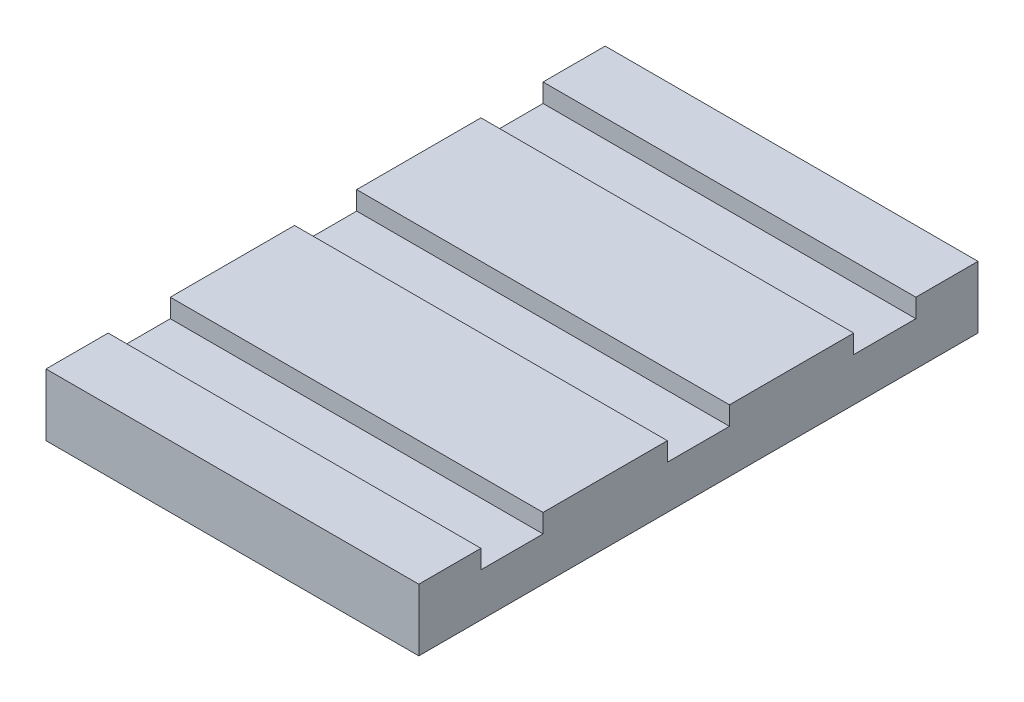
ISO-10303-21;
HEADER;
FILE_DESCRIPTION(('STEP AP214'),'2;1');
FILE_NAME('part.step','',(''),(''),'','','');
FILE_SCHEMA(('AUTOMOTIVE_DESIGN { 1 0 10303 214 1 1 1 1 }'));
ENDSEC;
DATA;
#1=APPLICATION_CONTEXT('core data for automotive mechanical design processes');
#2=APPLICATION_PROTOCOL_DEFINITION('international standard','automotive_design',2000,#1);
#3=PRODUCT_CONTEXT('',#1,'mechanical');
#4=PRODUCT('Part','Part','',(#3));
#5=PRODUCT_RELATED_PRODUCT_CATEGORY('part','',(#4));
#6=PRODUCT_DEFINITION_FORMATION('','',#4);
#7=PRODUCT_DEFINITION_CONTEXT('part definition',#1,'design');
#8=PRODUCT_DEFINITION('design','',#6,#7);
#9=PRODUCT_DEFINITION_SHAPE('','',#8);
#10=(LENGTH_UNIT() NAMED_UNIT(*) SI_UNIT(.MILLI.,.METRE.));
#11=(NAMED_UNIT(*) PLANE_ANGLE_UNIT() SI_UNIT($,.RADIAN.));
#12=(NAMED_UNIT(*) SI_UNIT($,.STERADIAN.) SOLID_ANGLE_UNIT());
#13=UNCERTAINTY_MEASURE_WITH_UNIT(LENGTH_MEASURE(1.E-05),#10,'distance_accuracy_value','');
#14=(GEOMETRIC_REPRESENTATION_CONTEXT(3) GLOBAL_UNCERTAINTY_ASSIGNED_CONTEXT((#13)) GLOBAL_UNIT_ASSIGNED_CONTEXT((#10,
#11,#12)) REPRESENTATION_CONTEXT('',''));
#15=CARTESIAN_POINT('',(0.,0.,0.));
#16=DIRECTION('',(0.,0.,1.));
#17=DIRECTION('',(1.,0.,0.));
#18=AXIS2_PLACEMENT_3D('',#15,#16,#17);
#19=CARTESIAN_POINT('',(0.,12.7,0.));
#20=DIRECTION('',(0.,1.,0.));
#21=DIRECTION('',(0.,0.,1.));
#22=AXIS2_PLACEMENT_3D('',#19,#20,#21);
#23=PLANE('',#22);
#24=DIRECTION('',(1.,0.,0.));
#25=VECTOR('',#24,1.);
#26=CARTESIAN_POINT('',(-38.1,12.7,6.35));
#27=LINE('',#26,#25);
#28=CARTESIAN_POINT('',(-38.1,12.7,6.35));
#29=VERTEX_POINT('',#28);
#30=CARTESIAN_POINT('',(38.1,12.7,6.34999999999999));
#31=VERTEX_POINT('',#30);
#32=EDGE_CURVE('E179',#29,#31,#27,.T.);
#33=ORIENTED_EDGE('',*,*,#32,.F.);
#34=DIRECTION('',(0.,0.,1.));
#35=VECTOR('',#34,1.);
#36=CARTESIAN_POINT('',(-38.1,12.7,-57.15));
#37=LINE('',#36,#35);
#38=CARTESIAN_POINT('',(-38.1,12.7,31.75));
#39=VERTEX_POINT('',#38);
#40=EDGE_CURVE('E171',#29,#39,#37,.T.);
#41=ORIENTED_EDGE('',*,*,#40,.T.);
#42=DIRECTION('',(1.,0.,0.));
#43=VECTOR('',#42,1.);
#44=CARTESIAN_POINT('',(-38.1,12.7,31.75));
#45=LINE('',#44,#43);
#46=CARTESIAN_POINT('',(38.1,12.7,31.75));
#47=VERTEX_POINT('',#46);
#48=EDGE_CURVE('E228',#39,#47,#45,.T.);
#49=ORIENTED_EDGE('',*,*,#48,.T.);
#50=DIRECTION('',(0.,0.,-1.));
#51=VECTOR('',#50,1.);
#52=CARTESIAN_POINT('',(38.1,12.7,-57.15));
#53=LINE('',#52,#51);
#54=EDGE_CURVE('E238',#47,#31,#53,.T.);
#55=ORIENTED_EDGE('',*,*,#54,.T.);
#56=EDGE_LOOP('',(#33,#41,#49,#55));
#57=FACE_BOUND('',#56,.T.);
#58=ADVANCED_FACE('F33',(#57),#23,.T.);
#59=CARTESIAN_POINT('',(38.1,12.7,-57.15));
#60=DIRECTION('',(-1.,0.,0.));
#61=DIRECTION('',(0.,0.,1.));
#62=AXIS2_PLACEMENT_3D('',#59,#60,#61);
#63=PLANE('',#62);
#64=DIRECTION('',(0.,0.,-1.));
#65=VECTOR('',#64,1.);
#66=CARTESIAN_POINT('',(38.1,8.89,6.35));
#67=LINE('',#66,#65);
#68=CARTESIAN_POINT('',(38.1,8.89,6.35));
#69=VERTEX_POINT('',#68);
#70=CARTESIAN_POINT('',(38.1,8.89,-6.35));
#71=VERTEX_POINT('',#70);
#72=EDGE_CURVE('E173',#69,#71,#67,.T.);
#73=ORIENTED_EDGE('',*,*,#72,.F.);
#74=DIRECTION('',(0.,-1.,0.));
#75=VECTOR('',#74,1.);
#76=CARTESIAN_POINT('',(38.1,12.7,6.34999999999999));
#77=LINE('',#76,#75);
#78=EDGE_CURVE('E154',#31,#69,#77,.T.);
#79=ORIENTED_EDGE('',*,*,#78,.F.);
#80=ORIENTED_EDGE('',*,*,#54,.F.);
#81=DIRECTION('',(0.,1.,0.));
#82=VECTOR('',#81,1.);
#83=CARTESIAN_POINT('',(38.1,12.7,31.75));
#84=LINE('',#83,#82);
#85=CARTESIAN_POINT('',(38.1,8.89,31.75));
#86=VERTEX_POINT('',#85);
#87=EDGE_CURVE('E213',#86,#47,#84,.T.);
#88=ORIENTED_EDGE('',*,*,#87,.F.);
#89=DIRECTION('',(0.,0.,-1.));
#90=VECTOR('',#89,1.);
#91=CARTESIAN_POINT('',(38.1,8.89,44.45));
#92=LINE('',#91,#90);
#93=CARTESIAN_POINT('',(38.1,8.89,44.45));
#94=VERTEX_POINT('',#93);
#95=EDGE_CURVE('E221',#94,#86,#92,.T.);
#96=ORIENTED_EDGE('',*,*,#95,.F.);
#97=DIRECTION('',(0.,-1.,0.));
#98=VECTOR('',#97,1.);
#99=CARTESIAN_POINT('',(38.1,12.7,44.45));
#100=LINE('',#99,#98);
#101=CARTESIAN_POINT('',(38.1,12.7,44.45));
#102=VERTEX_POINT('',#101);
#103=EDGE_CURVE('E202',#102,#94,#100,.T.);
#104=ORIENTED_EDGE('',*,*,#103,.F.);
#105=CARTESIAN_POINT('',(38.1,12.7,57.15));
#106=VERTEX_POINT('',#105);
#107=EDGE_CURVE('E234',#106,#102,#53,.T.);
#108=ORIENTED_EDGE('',*,*,#107,.F.);
#109=DIRECTION('',(0.,-1.,0.));
#110=VECTOR('',#109,1.);
#111=CARTESIAN_POINT('',(38.1,12.7,57.15));
#112=LINE('',#111,#110);
#113=CARTESIAN_POINT('',(38.1,0.,57.15));
#114=VERTEX_POINT('',#113);
#115=EDGE_CURVE('E248',#106,#114,#112,.T.);
#116=ORIENTED_EDGE('',*,*,#115,.T.);
#117=DIRECTION('',(0.,0.,-1.));
#118=VECTOR('',#117,1.);
#119=CARTESIAN_POINT('',(38.1,0.,-57.15));
#120=LINE('',#119,#118);
#121=CARTESIAN_POINT('',(38.1,0.,-57.15));
#122=VERTEX_POINT('',#121);
#123=EDGE_CURVE('E227',#114,#122,#120,.T.);
#124=ORIENTED_EDGE('',*,*,#123,.T.);
#125=DIRECTION('',(0.,-1.,0.));
#126=VECTOR('',#125,1.);
#127=CARTESIAN_POINT('',(38.1,12.7,-57.15));
#128=LINE('',#127,#126);
#129=CARTESIAN_POINT('',(38.1,12.7,-57.15));
#130=VERTEX_POINT('',#129);
#131=EDGE_CURVE('E11',#130,#122,#128,.T.);
#132=ORIENTED_EDGE('',*,*,#131,.F.);
#133=CARTESIAN_POINT('',(38.1,12.7,-44.45));
#134=VERTEX_POINT('',#133);
#135=EDGE_CURVE('E257',#134,#130,#53,.T.);
#136=ORIENTED_EDGE('',*,*,#135,.F.);
#137=DIRECTION('',(0.,-1.,0.));
#138=VECTOR('',#137,1.);
#139=CARTESIAN_POINT('',(38.1,12.7,-44.45));
#140=LINE('',#139,#138);
#141=CARTESIAN_POINT('',(38.1,8.89,-44.45));
#142=VERTEX_POINT('',#141);
#143=EDGE_CURVE('E181',#134,#142,#140,.T.);
#144=ORIENTED_EDGE('',*,*,#143,.T.);
#145=DIRECTION('',(0.,0.,1.));
#146=VECTOR('',#145,1.);
#147=CARTESIAN_POINT('',(38.1,8.89,-44.45));
#148=LINE('',#147,#146);
#149=CARTESIAN_POINT('',(38.1,8.89,-31.75));
#150=VERTEX_POINT('',#149);
#151=EDGE_CURVE('E187',#142,#150,#148,.T.);
#152=ORIENTED_EDGE('',*,*,#151,.T.);
#153=DIRECTION('',(0.,1.,0.));
#154=VECTOR('',#153,1.);
#155=CARTESIAN_POINT('',(38.1,12.7,-31.75));
#156=LINE('',#155,#154);
#157=CARTESIAN_POINT('',(38.1,12.7,-31.75));
#158=VERTEX_POINT('',#157);
#159=EDGE_CURVE('E194',#150,#158,#156,.T.);
#160=ORIENTED_EDGE('',*,*,#159,.T.);
#161=CARTESIAN_POINT('',(38.1,12.7,-6.35));
#162=VERTEX_POINT('',#161);
#163=EDGE_CURVE('E239',#162,#158,#53,.T.);
#164=ORIENTED_EDGE('',*,*,#163,.F.);
#165=DIRECTION('',(0.,1.,0.));
#166=VECTOR('',#165,1.);
#167=CARTESIAN_POINT('',(38.1,12.7,-6.35));
#168=LINE('',#167,#166);
#169=EDGE_CURVE('E48',#71,#162,#168,.T.);
#170=ORIENTED_EDGE('',*,*,#169,.F.);
#171=EDGE_LOOP('',(#73,#79,#80,#88,#96,#104,#108,#116,#124,#132,#136,#144,#152,#160,#164,#170));
#172=FACE_BOUND('',#171,.T.);
#173=ADVANCED_FACE('F35',(#172),#63,.F.);
#174=CARTESIAN_POINT('',(-38.1,12.7,-57.15));
#175=DIRECTION('',(1.,0.,0.));
#176=DIRECTION('',(0.,0.,-1.));
#177=AXIS2_PLACEMENT_3D('',#174,#175,#176);
#178=PLANE('',#177);
#179=ORIENTED_EDGE('',*,*,#40,.F.);
#180=DIRECTION('',(0.,-1.,0.));
#181=VECTOR('',#180,1.);
#182=CARTESIAN_POINT('',(-38.1,12.7,6.35));
#183=LINE('',#182,#181);
#184=CARTESIAN_POINT('',(-38.1,8.89,6.35000000000001));
#185=VERTEX_POINT('',#184);
#186=EDGE_CURVE('E151',#29,#185,#183,.T.);
#187=ORIENTED_EDGE('',*,*,#186,.T.);
#188=DIRECTION('',(0.,0.,-1.));
#189=VECTOR('',#188,1.);
#190=CARTESIAN_POINT('',(-38.1,8.89,6.35000000000001));
#191=LINE('',#190,#189);
#192=CARTESIAN_POINT('',(-38.1,8.89,-6.34999999999999));
#193=VERTEX_POINT('',#192);
#194=EDGE_CURVE('E162',#185,#193,#191,.T.);
#195=ORIENTED_EDGE('',*,*,#194,.T.);
#196=DIRECTION('',(0.,1.,0.));
#197=VECTOR('',#196,1.);
#198=CARTESIAN_POINT('',(-38.1,12.7,-6.34999999999999));
#199=LINE('',#198,#197);
#200=CARTESIAN_POINT('',(-38.1,12.7,-6.34999999999999));
#201=VERTEX_POINT('',#200);
#202=EDGE_CURVE('E159',#193,#201,#199,.T.);
#203=ORIENTED_EDGE('',*,*,#202,.T.);
#204=CARTESIAN_POINT('',(-38.1,12.7,-31.75));
#205=VERTEX_POINT('',#204);
#206=EDGE_CURVE('E246',#205,#201,#37,.T.);
#207=ORIENTED_EDGE('',*,*,#206,.F.);
#208=DIRECTION('',(0.,1.,0.));
#209=VECTOR('',#208,1.);
#210=CARTESIAN_POINT('',(-38.1,12.7,-31.75));
#211=LINE('',#210,#209);
#212=CARTESIAN_POINT('',(-38.1,8.89,-31.75));
#213=VERTEX_POINT('',#212);
#214=EDGE_CURVE('E56',#213,#205,#211,.T.);
#215=ORIENTED_EDGE('',*,*,#214,.F.);
#216=DIRECTION('',(0.,0.,1.));
#217=VECTOR('',#216,1.);
#218=CARTESIAN_POINT('',(-38.1,8.89,-44.45));
#219=LINE('',#218,#217);
#220=CARTESIAN_POINT('',(-38.1,8.89,-44.45));
#221=VERTEX_POINT('',#220);
#222=EDGE_CURVE('E189',#221,#213,#219,.T.);
#223=ORIENTED_EDGE('',*,*,#222,.F.);
#224=DIRECTION('',(0.,-1.,0.));
#225=VECTOR('',#224,1.);
#226=CARTESIAN_POINT('',(-38.1,12.7,-44.45));
#227=LINE('',#226,#225);
#228=CARTESIAN_POINT('',(-38.1,12.7,-44.45));
#229=VERTEX_POINT('',#228);
#230=EDGE_CURVE('E185',#229,#221,#227,.T.);
#231=ORIENTED_EDGE('',*,*,#230,.F.);
#232=CARTESIAN_POINT('',(-38.1,12.7,-57.15));
#233=VERTEX_POINT('',#232);
#234=EDGE_CURVE('E242',#233,#229,#37,.T.);
#235=ORIENTED_EDGE('',*,*,#234,.F.);
#236=DIRECTION('',(0.,-1.,0.));
#237=VECTOR('',#236,1.);
#238=CARTESIAN_POINT('',(-38.1,12.7,-57.15));
#239=LINE('',#238,#237);
#240=CARTESIAN_POINT('',(-38.1,0.,-57.15));
#241=VERTEX_POINT('',#240);
#242=EDGE_CURVE('E41',#233,#241,#239,.T.);
#243=ORIENTED_EDGE('',*,*,#242,.T.);
#244=DIRECTION('',(0.,0.,1.));
#245=VECTOR('',#244,1.);
#246=CARTESIAN_POINT('',(-38.1,0.,-57.15));
#247=LINE('',#246,#245);
#248=CARTESIAN_POINT('',(-38.1,0.,57.15));
#249=VERTEX_POINT('',#248);
#250=EDGE_CURVE('E253',#241,#249,#247,.T.);
#251=ORIENTED_EDGE('',*,*,#250,.T.);
#252=DIRECTION('',(0.,-1.,0.));
#253=VECTOR('',#252,1.);
#254=CARTESIAN_POINT('',(-38.1,12.7,57.15));
#255=LINE('',#254,#253);
#256=CARTESIAN_POINT('',(-38.1,12.7,57.15));
#257=VERTEX_POINT('',#256);
#258=EDGE_CURVE('E260',#257,#249,#255,.T.);
#259=ORIENTED_EDGE('',*,*,#258,.F.);
#260=CARTESIAN_POINT('',(-38.1,12.7,44.45));
#261=VERTEX_POINT('',#260);
#262=EDGE_CURVE('E241',#261,#257,#37,.T.);
#263=ORIENTED_EDGE('',*,*,#262,.F.);
#264=DIRECTION('',(0.,-1.,0.));
#265=VECTOR('',#264,1.);
#266=CARTESIAN_POINT('',(-38.1,12.7,44.45));
#267=LINE('',#266,#265);
#268=CARTESIAN_POINT('',(-38.1,8.89,44.45));
#269=VERTEX_POINT('',#268);
#270=EDGE_CURVE('E209',#261,#269,#267,.T.);
#271=ORIENTED_EDGE('',*,*,#270,.T.);
#272=DIRECTION('',(0.,0.,-1.));
#273=VECTOR('',#272,1.);
#274=CARTESIAN_POINT('',(-38.1,8.89,44.45));
#275=LINE('',#274,#273);
#276=CARTESIAN_POINT('',(-38.1,8.89,31.75));
#277=VERTEX_POINT('',#276);
#278=EDGE_CURVE('E212',#269,#277,#275,.T.);
#279=ORIENTED_EDGE('',*,*,#278,.T.);
#280=DIRECTION('',(0.,1.,0.));
#281=VECTOR('',#280,1.);
#282=CARTESIAN_POINT('',(-38.1,12.7,31.75));
#283=LINE('',#282,#281);
#284=EDGE_CURVE('E216',#277,#39,#283,.T.);
#285=ORIENTED_EDGE('',*,*,#284,.T.);
#286=EDGE_LOOP('',(#179,#187,#195,#203,#207,#215,#223,#231,#235,#243,#251,#259,#263,#271,#279,#285));
#287=FACE_BOUND('',#286,.T.);
#288=ADVANCED_FACE('F169',(#287),#178,.F.);
#289=ORIENTED_EDGE('',*,*,#234,.T.);
#290=DIRECTION('',(1.,0.,0.));
#291=VECTOR('',#290,1.);
#292=CARTESIAN_POINT('',(-38.1,12.7,-44.45));
#293=LINE('',#292,#291);
#294=EDGE_CURVE('E191',#229,#134,#293,.T.);
#295=ORIENTED_EDGE('',*,*,#294,.T.);
#296=ORIENTED_EDGE('',*,*,#135,.T.);
#297=DIRECTION('',(-1.,0.,0.));
#298=VECTOR('',#297,1.);
#299=CARTESIAN_POINT('',(-38.1,12.7,-57.15));
#300=LINE('',#299,#298);
#301=EDGE_CURVE('E237',#130,#233,#300,.T.);
#302=ORIENTED_EDGE('',*,*,#301,.T.);
#303=EDGE_LOOP('',(#289,#295,#296,#302));
#304=FACE_BOUND('',#303,.T.);
#305=ADVANCED_FACE('F298',(#304),#23,.T.);
#306=DIRECTION('',(1.,0.,0.));
#307=VECTOR('',#306,1.);
#308=CARTESIAN_POINT('',(-38.1,12.7,-6.34999999999999));
#309=LINE('',#308,#307);
#310=EDGE_CURVE('E182',#201,#162,#309,.T.);
#311=ORIENTED_EDGE('',*,*,#310,.T.);
#312=ORIENTED_EDGE('',*,*,#163,.T.);
#313=DIRECTION('',(1.,0.,0.));
#314=VECTOR('',#313,1.);
#315=CARTESIAN_POINT('',(-38.1,12.7,-31.75));
#316=LINE('',#315,#314);
#317=EDGE_CURVE('E205',#205,#158,#316,.T.);
#318=ORIENTED_EDGE('',*,*,#317,.F.);
#319=ORIENTED_EDGE('',*,*,#206,.T.);
#320=EDGE_LOOP('',(#311,#312,#318,#319));
#321=FACE_BOUND('',#320,.T.);
#322=ADVANCED_FACE('F290',(#321),#23,.T.);
#323=DIRECTION('',(1.,0.,0.));
#324=VECTOR('',#323,1.);
#325=CARTESIAN_POINT('',(-38.1,12.7,44.45));
#326=LINE('',#325,#324);
#327=EDGE_CURVE('E225',#261,#102,#326,.T.);
#328=ORIENTED_EDGE('',*,*,#327,.F.);
#329=ORIENTED_EDGE('',*,*,#262,.T.);
#330=DIRECTION('',(1.,0.,0.));
#331=VECTOR('',#330,1.);
#332=CARTESIAN_POINT('',(-38.1,12.7,57.15));
#333=LINE('',#332,#331);
#334=EDGE_CURVE('E245',#257,#106,#333,.T.);
#335=ORIENTED_EDGE('',*,*,#334,.T.);
#336=ORIENTED_EDGE('',*,*,#107,.T.);
#337=EDGE_LOOP('',(#328,#329,#335,#336));
#338=FACE_BOUND('',#337,.T.);
#339=ADVANCED_FACE('F285',(#338),#23,.T.);
#340=CARTESIAN_POINT('',(-38.1,12.7,-57.15));
#341=DIRECTION('',(0.,0.,1.));
#342=DIRECTION('',(1.,0.,0.));
#343=AXIS2_PLACEMENT_3D('',#340,#341,#342);
#344=PLANE('',#343);
#345=DIRECTION('',(-1.,0.,0.));
#346=VECTOR('',#345,1.);
#347=CARTESIAN_POINT('',(-38.1,0.,-57.15));
#348=LINE('',#347,#346);
#349=EDGE_CURVE('E251',#122,#241,#348,.T.);
#350=ORIENTED_EDGE('',*,*,#349,.T.);
#351=ORIENTED_EDGE('',*,*,#242,.F.);
#352=ORIENTED_EDGE('',*,*,#301,.F.);
#353=ORIENTED_EDGE('',*,*,#131,.T.);
#354=EDGE_LOOP('',(#350,#351,#352,#353));
#355=FACE_BOUND('',#354,.T.);
#356=ADVANCED_FACE('F299',(#355),#344,.F.);
#357=CARTESIAN_POINT('',(-38.1,12.7,57.15));
#358=DIRECTION('',(0.,0.,-1.));
#359=DIRECTION('',(-1.,0.,0.));
#360=AXIS2_PLACEMENT_3D('',#357,#358,#359);
#361=PLANE('',#360);
#362=DIRECTION('',(1.,0.,0.));
#363=VECTOR('',#362,1.);
#364=CARTESIAN_POINT('',(-38.1,0.,57.15));
#365=LINE('',#364,#363);
#366=EDGE_CURVE('E255',#249,#114,#365,.T.);
#367=ORIENTED_EDGE('',*,*,#366,.T.);
#368=ORIENTED_EDGE('',*,*,#115,.F.);
#369=ORIENTED_EDGE('',*,*,#334,.F.);
#370=ORIENTED_EDGE('',*,*,#258,.T.);
#371=EDGE_LOOP('',(#367,#368,#369,#370));
#372=FACE_BOUND('',#371,.T.);
#373=ADVANCED_FACE('F276',(#372),#361,.F.);
#374=CARTESIAN_POINT('',(0.,0.,0.));
#375=DIRECTION('',(0.,1.,0.));
#376=DIRECTION('',(0.,0.,1.));
#377=AXIS2_PLACEMENT_3D('',#374,#375,#376);
#378=PLANE('',#377);
#379=ORIENTED_EDGE('',*,*,#123,.F.);
#380=ORIENTED_EDGE('',*,*,#366,.F.);
#381=ORIENTED_EDGE('',*,*,#250,.F.);
#382=ORIENTED_EDGE('',*,*,#349,.F.);
#383=EDGE_LOOP('',(#379,#380,#381,#382));
#384=FACE_BOUND('',#383,.T.);
#385=ADVANCED_FACE('F273',(#384),#378,.F.);
#386=CARTESIAN_POINT('',(-38.1,12.7,44.45));
#387=DIRECTION('',(0.,0.,1.));
#388=DIRECTION('',(1.,0.,0.));
#389=AXIS2_PLACEMENT_3D('',#386,#387,#388);
#390=PLANE('',#389);
#391=ORIENTED_EDGE('',*,*,#103,.T.);
#392=DIRECTION('',(1.,0.,0.));
#393=VECTOR('',#392,1.);
#394=CARTESIAN_POINT('',(-38.1,8.89,44.45));
#395=LINE('',#394,#393);
#396=EDGE_CURVE('E218',#269,#94,#395,.T.);
#397=ORIENTED_EDGE('',*,*,#396,.F.);
#398=ORIENTED_EDGE('',*,*,#270,.F.);
#399=ORIENTED_EDGE('',*,*,#327,.T.);
#400=EDGE_LOOP('',(#391,#397,#398,#399));
#401=FACE_BOUND('',#400,.T.);
#402=ADVANCED_FACE('F323',(#401),#390,.F.);
#403=CARTESIAN_POINT('',(-38.1,12.7,31.75));
#404=DIRECTION('',(0.,0.,-1.));
#405=DIRECTION('',(-1.,0.,0.));
#406=AXIS2_PLACEMENT_3D('',#403,#404,#405);
#407=PLANE('',#406);
#408=ORIENTED_EDGE('',*,*,#87,.T.);
#409=ORIENTED_EDGE('',*,*,#48,.F.);
#410=ORIENTED_EDGE('',*,*,#284,.F.);
#411=DIRECTION('',(1.,0.,0.));
#412=VECTOR('',#411,1.);
#413=CARTESIAN_POINT('',(-38.1,8.89,31.75));
#414=LINE('',#413,#412);
#415=EDGE_CURVE('E231',#277,#86,#414,.T.);
#416=ORIENTED_EDGE('',*,*,#415,.T.);
#417=EDGE_LOOP('',(#408,#409,#410,#416));
#418=FACE_BOUND('',#417,.T.);
#419=ADVANCED_FACE('F327',(#418),#407,.F.);
#420=CARTESIAN_POINT('',(-38.1,8.89,44.45));
#421=DIRECTION('',(0.,-1.,0.));
#422=DIRECTION('',(0.,0.,-1.));
#423=AXIS2_PLACEMENT_3D('',#420,#421,#422);
#424=PLANE('',#423);
#425=ORIENTED_EDGE('',*,*,#95,.T.);
#426=ORIENTED_EDGE('',*,*,#415,.F.);
#427=ORIENTED_EDGE('',*,*,#278,.F.);
#428=ORIENTED_EDGE('',*,*,#396,.T.);
#429=EDGE_LOOP('',(#425,#426,#427,#428));
#430=FACE_BOUND('',#429,.T.);
#431=ADVANCED_FACE('F332',(#430),#424,.F.);
#432=CARTESIAN_POINT('',(-38.1,12.7,-44.45));
#433=DIRECTION('',(0.,0.,1.));
#434=DIRECTION('',(1.,0.,0.));
#435=AXIS2_PLACEMENT_3D('',#432,#433,#434);
#436=PLANE('',#435);
#437=ORIENTED_EDGE('',*,*,#143,.F.);
#438=ORIENTED_EDGE('',*,*,#294,.F.);
#439=ORIENTED_EDGE('',*,*,#230,.T.);
#440=DIRECTION('',(1.,0.,0.));
#441=VECTOR('',#440,1.);
#442=CARTESIAN_POINT('',(-38.1,8.89,-44.45));
#443=LINE('',#442,#441);
#444=EDGE_CURVE('E199',#221,#142,#443,.T.);
#445=ORIENTED_EDGE('',*,*,#444,.T.);
#446=EDGE_LOOP('',(#437,#438,#439,#445));
#447=FACE_BOUND('',#446,.T.);
#448=ADVANCED_FACE('F337',(#447),#436,.T.);
#449=CARTESIAN_POINT('',(-38.1,8.89,-44.45));
#450=DIRECTION('',(0.,1.,0.));
#451=DIRECTION('',(0.,0.,1.));
#452=AXIS2_PLACEMENT_3D('',#449,#450,#451);
#453=PLANE('',#452);
#454=ORIENTED_EDGE('',*,*,#151,.F.);
#455=ORIENTED_EDGE('',*,*,#444,.F.);
#456=ORIENTED_EDGE('',*,*,#222,.T.);
#457=DIRECTION('',(1.,0.,0.));
#458=VECTOR('',#457,1.);
#459=CARTESIAN_POINT('',(-38.1,8.89,-31.75));
#460=LINE('',#459,#458);
#461=EDGE_CURVE('E203',#213,#150,#460,.T.);
#462=ORIENTED_EDGE('',*,*,#461,.T.);
#463=EDGE_LOOP('',(#454,#455,#456,#462));
#464=FACE_BOUND('',#463,.T.);
#465=ADVANCED_FACE('F342',(#464),#453,.T.);
#466=CARTESIAN_POINT('',(-38.1,12.7,-31.75));
#467=DIRECTION('',(0.,0.,-1.));
#468=DIRECTION('',(-1.,0.,0.));
#469=AXIS2_PLACEMENT_3D('',#466,#467,#468);
#470=PLANE('',#469);
#471=ORIENTED_EDGE('',*,*,#159,.F.);
#472=ORIENTED_EDGE('',*,*,#461,.F.);
#473=ORIENTED_EDGE('',*,*,#214,.T.);
#474=ORIENTED_EDGE('',*,*,#317,.T.);
#475=EDGE_LOOP('',(#471,#472,#473,#474));
#476=FACE_BOUND('',#475,.T.);
#477=ADVANCED_FACE('F344',(#476),#470,.T.);
#478=CARTESIAN_POINT('',(-38.1,12.7,6.35));
#479=DIRECTION('',(0.,0.,1.));
#480=DIRECTION('',(0.,-1.,0.));
#481=AXIS2_PLACEMENT_3D('',#478,#479,#480);
#482=PLANE('',#481);
#483=ORIENTED_EDGE('',*,*,#78,.T.);
#484=DIRECTION('',(1.,0.,0.));
#485=VECTOR('',#484,1.);
#486=CARTESIAN_POINT('',(-38.1,8.89,6.35000000000001));
#487=LINE('',#486,#485);
#488=EDGE_CURVE('E147',#185,#69,#487,.T.);
#489=ORIENTED_EDGE('',*,*,#488,.F.);
#490=ORIENTED_EDGE('',*,*,#186,.F.);
#491=ORIENTED_EDGE('',*,*,#32,.T.);
#492=EDGE_LOOP('',(#483,#489,#490,#491));
#493=FACE_BOUND('',#492,.T.);
#494=ADVANCED_FACE('F149',(#493),#482,.F.);
#495=CARTESIAN_POINT('',(-38.1,12.7,-6.34999999999999));
#496=DIRECTION('',(0.,0.,-1.));
#497=DIRECTION('',(-1.,0.,0.));
#498=AXIS2_PLACEMENT_3D('',#495,#496,#497);
#499=PLANE('',#498);
#500=ORIENTED_EDGE('',*,*,#169,.T.);
#501=ORIENTED_EDGE('',*,*,#310,.F.);
#502=ORIENTED_EDGE('',*,*,#202,.F.);
#503=DIRECTION('',(1.,0.,0.));
#504=VECTOR('',#503,1.);
#505=CARTESIAN_POINT('',(-38.1,8.89,-6.34999999999999));
#506=LINE('',#505,#504);
#507=EDGE_CURVE('E158',#193,#71,#506,.T.);
#508=ORIENTED_EDGE('',*,*,#507,.T.);
#509=EDGE_LOOP('',(#500,#501,#502,#508));
#510=FACE_BOUND('',#509,.T.);
#511=ADVANCED_FACE('F293',(#510),#499,.F.);
#512=CARTESIAN_POINT('',(-38.1,8.89,6.35000000000001));
#513=DIRECTION('',(0.,-1.,0.));
#514=DIRECTION('',(0.,0.,-1.));
#515=AXIS2_PLACEMENT_3D('',#512,#513,#514);
#516=PLANE('',#515);
#517=ORIENTED_EDGE('',*,*,#72,.T.);
#518=ORIENTED_EDGE('',*,*,#507,.F.);
#519=ORIENTED_EDGE('',*,*,#194,.F.);
#520=ORIENTED_EDGE('',*,*,#488,.T.);
#521=EDGE_LOOP('',(#517,#518,#519,#520));
#522=FACE_BOUND('',#521,.T.);
#523=ADVANCED_FACE('F163',(#522),#516,.F.);
#524=CLOSED_SHELL('',(#58,#173,#288,#305,#322,#339,#356,#373,#385,#402,#419,#431,#448,#465,#477,
#494,#511,#523));
#525=MANIFOLD_SOLID_BREP('B2',#524);
#526=ADVANCED_BREP_SHAPE_REPRESENTATION('',(#18,#525),#14);
#527=SHAPE_DEFINITION_REPRESENTATION(#9,#526);
ENDSEC;
END-ISO-10303-21;
